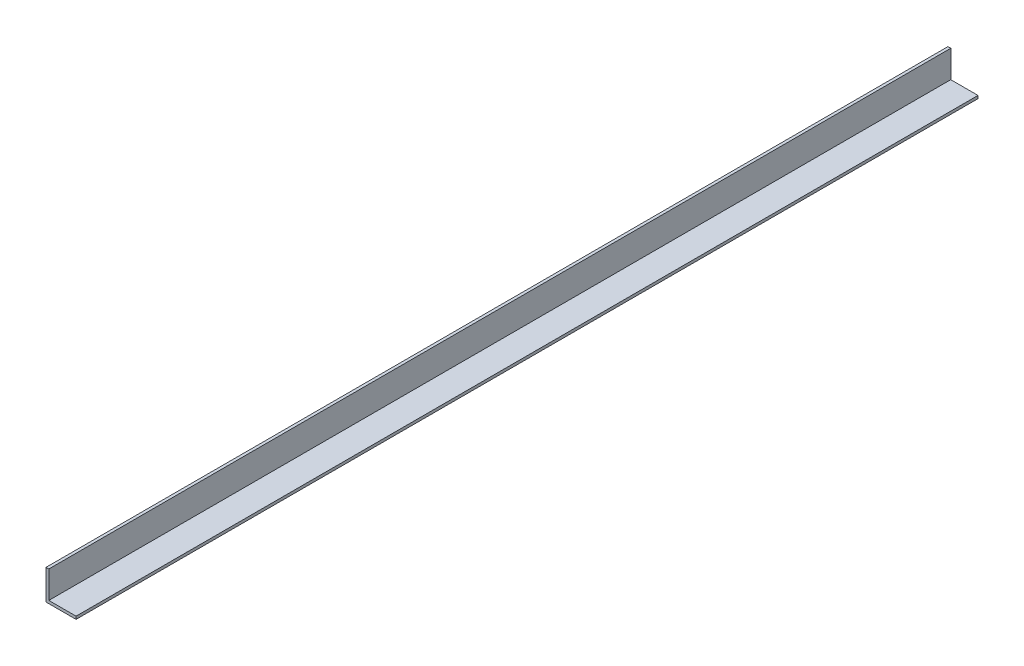
ISO-10303-21;
HEADER;
FILE_DESCRIPTION(('STEP AP214'),'2;1');
FILE_NAME('part.step','',(''),(''),'','','');
FILE_SCHEMA(('AUTOMOTIVE_DESIGN { 1 0 10303 214 1 1 1 1 }'));
ENDSEC;
DATA;
#1=APPLICATION_CONTEXT('core data for automotive mechanical design processes');
#2=APPLICATION_PROTOCOL_DEFINITION('international standard','automotive_design',2000,#1);
#3=PRODUCT_CONTEXT('',#1,'mechanical');
#4=PRODUCT('Part','Part','',(#3));
#5=PRODUCT_RELATED_PRODUCT_CATEGORY('part','',(#4));
#6=PRODUCT_DEFINITION_FORMATION('','',#4);
#7=PRODUCT_DEFINITION_CONTEXT('part definition',#1,'design');
#8=PRODUCT_DEFINITION('design','',#6,#7);
#9=PRODUCT_DEFINITION_SHAPE('','',#8);
#10=(LENGTH_UNIT() NAMED_UNIT(*) SI_UNIT(.MILLI.,.METRE.));
#11=(NAMED_UNIT(*) PLANE_ANGLE_UNIT() SI_UNIT($,.RADIAN.));
#12=(NAMED_UNIT(*) SI_UNIT($,.STERADIAN.) SOLID_ANGLE_UNIT());
#13=UNCERTAINTY_MEASURE_WITH_UNIT(LENGTH_MEASURE(1.E-05),#10,'distance_accuracy_value','');
#14=(GEOMETRIC_REPRESENTATION_CONTEXT(3) GLOBAL_UNCERTAINTY_ASSIGNED_CONTEXT((#13)) GLOBAL_UNIT_ASSIGNED_CONTEXT((#10,
#11,#12)) REPRESENTATION_CONTEXT('',''));
#15=CARTESIAN_POINT('',(0.,0.,0.));
#16=DIRECTION('',(0.,0.,1.));
#17=DIRECTION('',(1.,0.,0.));
#18=AXIS2_PLACEMENT_3D('',#15,#16,#17);
#19=CARTESIAN_POINT('',(19.05,203.3,-6100.));
#20=DIRECTION('',(0.,1.,0.));
#21=DIRECTION('',(0.,0.,1.));
#22=AXIS2_PLACEMENT_3D('',#19,#20,#21);
#23=PLANE('',#22);
#24=DIRECTION('',(-1.,0.,0.));
#25=VECTOR('',#24,1.);
#26=CARTESIAN_POINT('',(19.05,203.3,0.));
#27=LINE('',#26,#25);
#28=CARTESIAN_POINT('',(19.05,203.3,0.));
#29=VERTEX_POINT('',#28);
#30=CARTESIAN_POINT('',(0.,203.3,0.));
#31=VERTEX_POINT('',#30);
#32=EDGE_CURVE('E118',#29,#31,#27,.T.);
#33=ORIENTED_EDGE('',*,*,#32,.F.);
#34=DIRECTION('',(0.,0.,1.));
#35=VECTOR('',#34,1.);
#36=CARTESIAN_POINT('',(19.05,203.3,-6100.));
#37=LINE('',#36,#35);
#38=CARTESIAN_POINT('',(19.05,203.3,-6100.));
#39=VERTEX_POINT('',#38);
#40=EDGE_CURVE('E11',#39,#29,#37,.T.);
#41=ORIENTED_EDGE('',*,*,#40,.F.);
#42=DIRECTION('',(-1.,0.,0.));
#43=VECTOR('',#42,1.);
#44=CARTESIAN_POINT('',(19.05,203.3,-6100.));
#45=LINE('',#44,#43);
#46=CARTESIAN_POINT('',(0.,203.3,-6100.));
#47=VERTEX_POINT('',#46);
#48=EDGE_CURVE('E132',#39,#47,#45,.T.);
#49=ORIENTED_EDGE('',*,*,#48,.T.);
#50=DIRECTION('',(0.,0.,1.));
#51=VECTOR('',#50,1.);
#52=CARTESIAN_POINT('',(0.,203.3,-6100.));
#53=LINE('',#52,#51);
#54=EDGE_CURVE('E36',#47,#31,#53,.T.);
#55=ORIENTED_EDGE('',*,*,#54,.T.);
#56=EDGE_LOOP('',(#33,#41,#49,#55));
#57=FACE_BOUND('',#56,.T.);
#58=ADVANCED_FACE('F33',(#57),#23,.T.);
#59=CARTESIAN_POINT('',(19.05,19.05,-6100.));
#60=DIRECTION('',(1.,0.,0.));
#61=DIRECTION('',(0.,1.,0.));
#62=AXIS2_PLACEMENT_3D('',#59,#60,#61);
#63=PLANE('',#62);
#64=DIRECTION('',(0.,1.,0.));
#65=VECTOR('',#64,1.);
#66=CARTESIAN_POINT('',(19.05,19.05,0.));
#67=LINE('',#66,#65);
#68=CARTESIAN_POINT('',(19.05,19.05,0.));
#69=VERTEX_POINT('',#68);
#70=EDGE_CURVE('E130',#69,#29,#67,.T.);
#71=ORIENTED_EDGE('',*,*,#70,.F.);
#72=DIRECTION('',(0.,0.,1.));
#73=VECTOR('',#72,1.);
#74=CARTESIAN_POINT('',(19.05,19.05,-6100.));
#75=LINE('',#74,#73);
#76=CARTESIAN_POINT('',(19.05,19.05,-6100.));
#77=VERTEX_POINT('',#76);
#78=EDGE_CURVE('E42',#77,#69,#75,.T.);
#79=ORIENTED_EDGE('',*,*,#78,.F.);
#80=DIRECTION('',(0.,1.,0.));
#81=VECTOR('',#80,1.);
#82=CARTESIAN_POINT('',(19.05,19.05,-6100.));
#83=LINE('',#82,#81);
#84=EDGE_CURVE('E108',#77,#39,#83,.T.);
#85=ORIENTED_EDGE('',*,*,#84,.T.);
#86=ORIENTED_EDGE('',*,*,#40,.T.);
#87=EDGE_LOOP('',(#71,#79,#85,#86));
#88=FACE_BOUND('',#87,.T.);
#89=ADVANCED_FACE('F140',(#88),#63,.T.);
#90=CARTESIAN_POINT('',(203.3,19.05,-6100.));
#91=DIRECTION('',(0.,1.,0.));
#92=DIRECTION('',(-1.,0.,0.));
#93=AXIS2_PLACEMENT_3D('',#90,#91,#92);
#94=PLANE('',#93);
#95=DIRECTION('',(-1.,0.,0.));
#96=VECTOR('',#95,1.);
#97=CARTESIAN_POINT('',(203.3,19.05,0.));
#98=LINE('',#97,#96);
#99=CARTESIAN_POINT('',(203.3,19.05,0.));
#100=VERTEX_POINT('',#99);
#101=EDGE_CURVE('E95',#100,#69,#98,.T.);
#102=ORIENTED_EDGE('',*,*,#101,.F.);
#103=DIRECTION('',(0.,0.,1.));
#104=VECTOR('',#103,1.);
#105=CARTESIAN_POINT('',(203.3,19.05,-6100.));
#106=LINE('',#105,#104);
#107=CARTESIAN_POINT('',(203.3,19.05,-6100.));
#108=VERTEX_POINT('',#107);
#109=EDGE_CURVE('E90',#108,#100,#106,.T.);
#110=ORIENTED_EDGE('',*,*,#109,.F.);
#111=DIRECTION('',(-1.,0.,0.));
#112=VECTOR('',#111,1.);
#113=CARTESIAN_POINT('',(203.3,19.05,-6100.));
#114=LINE('',#113,#112);
#115=EDGE_CURVE('E93',#108,#77,#114,.T.);
#116=ORIENTED_EDGE('',*,*,#115,.T.);
#117=ORIENTED_EDGE('',*,*,#78,.T.);
#118=EDGE_LOOP('',(#102,#110,#116,#117));
#119=FACE_BOUND('',#118,.T.);
#120=ADVANCED_FACE('F92',(#119),#94,.T.);
#121=CARTESIAN_POINT('',(203.3,0.,-6100.));
#122=DIRECTION('',(1.,0.,0.));
#123=DIRECTION('',(0.,0.,-1.));
#124=AXIS2_PLACEMENT_3D('',#121,#122,#123);
#125=PLANE('',#124);
#126=DIRECTION('',(0.,1.,0.));
#127=VECTOR('',#126,1.);
#128=CARTESIAN_POINT('',(203.3,0.,0.));
#129=LINE('',#128,#127);
#130=CARTESIAN_POINT('',(203.3,0.,0.));
#131=VERTEX_POINT('',#130);
#132=EDGE_CURVE('E127',#131,#100,#129,.T.);
#133=ORIENTED_EDGE('',*,*,#132,.F.);
#134=DIRECTION('',(0.,0.,1.));
#135=VECTOR('',#134,1.);
#136=CARTESIAN_POINT('',(203.3,0.,-6100.));
#137=LINE('',#136,#135);
#138=CARTESIAN_POINT('',(203.3,0.,-6100.));
#139=VERTEX_POINT('',#138);
#140=EDGE_CURVE('E100',#139,#131,#137,.T.);
#141=ORIENTED_EDGE('',*,*,#140,.F.);
#142=DIRECTION('',(0.,1.,0.));
#143=VECTOR('',#142,1.);
#144=CARTESIAN_POINT('',(203.3,0.,-6100.));
#145=LINE('',#144,#143);
#146=EDGE_CURVE('E106',#139,#108,#145,.T.);
#147=ORIENTED_EDGE('',*,*,#146,.T.);
#148=ORIENTED_EDGE('',*,*,#109,.T.);
#149=EDGE_LOOP('',(#133,#141,#147,#148));
#150=FACE_BOUND('',#149,.T.);
#151=ADVANCED_FACE('F110',(#150),#125,.T.);
#152=CARTESIAN_POINT('',(0.,0.,-6100.));
#153=DIRECTION('',(0.,-1.,0.));
#154=DIRECTION('',(0.,0.,-1.));
#155=AXIS2_PLACEMENT_3D('',#152,#153,#154);
#156=PLANE('',#155);
#157=DIRECTION('',(1.,0.,0.));
#158=VECTOR('',#157,1.);
#159=CARTESIAN_POINT('',(0.,0.,0.));
#160=LINE('',#159,#158);
#161=CARTESIAN_POINT('',(0.,0.,0.));
#162=VERTEX_POINT('',#161);
#163=EDGE_CURVE('E124',#162,#131,#160,.T.);
#164=ORIENTED_EDGE('',*,*,#163,.F.);
#165=DIRECTION('',(0.,0.,1.));
#166=VECTOR('',#165,1.);
#167=CARTESIAN_POINT('',(0.,0.,-6100.));
#168=LINE('',#167,#166);
#169=CARTESIAN_POINT('',(0.,0.,-6100.));
#170=VERTEX_POINT('',#169);
#171=EDGE_CURVE('E135',#170,#162,#168,.T.);
#172=ORIENTED_EDGE('',*,*,#171,.F.);
#173=DIRECTION('',(1.,0.,0.));
#174=VECTOR('',#173,1.);
#175=CARTESIAN_POINT('',(0.,0.,-6100.));
#176=LINE('',#175,#174);
#177=EDGE_CURVE('E111',#170,#139,#176,.T.);
#178=ORIENTED_EDGE('',*,*,#177,.T.);
#179=ORIENTED_EDGE('',*,*,#140,.T.);
#180=EDGE_LOOP('',(#164,#172,#178,#179));
#181=FACE_BOUND('',#180,.T.);
#182=ADVANCED_FACE('F153',(#181),#156,.T.);
#183=CARTESIAN_POINT('',(0.,203.3,-6100.));
#184=DIRECTION('',(-1.,0.,0.));
#185=DIRECTION('',(0.,-1.,0.));
#186=AXIS2_PLACEMENT_3D('',#183,#184,#185);
#187=PLANE('',#186);
#188=DIRECTION('',(0.,-1.,0.));
#189=VECTOR('',#188,1.);
#190=CARTESIAN_POINT('',(0.,203.3,0.));
#191=LINE('',#190,#189);
#192=EDGE_CURVE('E121',#31,#162,#191,.T.);
#193=ORIENTED_EDGE('',*,*,#192,.F.);
#194=ORIENTED_EDGE('',*,*,#54,.F.);
#195=DIRECTION('',(0.,-1.,0.));
#196=VECTOR('',#195,1.);
#197=CARTESIAN_POINT('',(0.,203.3,-6100.));
#198=LINE('',#197,#196);
#199=EDGE_CURVE('E113',#47,#170,#198,.T.);
#200=ORIENTED_EDGE('',*,*,#199,.T.);
#201=ORIENTED_EDGE('',*,*,#171,.T.);
#202=EDGE_LOOP('',(#193,#194,#200,#201));
#203=FACE_BOUND('',#202,.T.);
#204=ADVANCED_FACE('F137',(#203),#187,.T.);
#205=CARTESIAN_POINT('',(0.,0.,-6100.));
#206=DIRECTION('',(0.,0.,1.));
#207=DIRECTION('',(1.,0.,0.));
#208=AXIS2_PLACEMENT_3D('',#205,#206,#207);
#209=PLANE('',#208);
#210=ORIENTED_EDGE('',*,*,#48,.F.);
#211=ORIENTED_EDGE('',*,*,#84,.F.);
#212=ORIENTED_EDGE('',*,*,#115,.F.);
#213=ORIENTED_EDGE('',*,*,#146,.F.);
#214=ORIENTED_EDGE('',*,*,#177,.F.);
#215=ORIENTED_EDGE('',*,*,#199,.F.);
#216=EDGE_LOOP('',(#210,#211,#212,#213,#214,#215));
#217=FACE_BOUND('',#216,.T.);
#218=ADVANCED_FACE('F104',(#217),#209,.F.);
#219=CARTESIAN_POINT('',(0.,0.,0.));
#220=DIRECTION('',(0.,0.,1.));
#221=DIRECTION('',(1.,0.,0.));
#222=AXIS2_PLACEMENT_3D('',#219,#220,#221);
#223=PLANE('',#222);
#224=ORIENTED_EDGE('',*,*,#32,.T.);
#225=ORIENTED_EDGE('',*,*,#192,.T.);
#226=ORIENTED_EDGE('',*,*,#163,.T.);
#227=ORIENTED_EDGE('',*,*,#132,.T.);
#228=ORIENTED_EDGE('',*,*,#101,.T.);
#229=ORIENTED_EDGE('',*,*,#70,.T.);
#230=EDGE_LOOP('',(#224,#225,#226,#227,#228,#229));
#231=FACE_BOUND('',#230,.T.);
#232=ADVANCED_FACE('F139',(#231),#223,.T.);
#233=CLOSED_SHELL('',(#58,#89,#120,#151,#182,#204,#218,#232));
#234=MANIFOLD_SOLID_BREP('B2',#233);
#235=ADVANCED_BREP_SHAPE_REPRESENTATION('',(#18,#234),#14);
#236=SHAPE_DEFINITION_REPRESENTATION(#9,#235);
ENDSEC;
END-ISO-10303-21;
